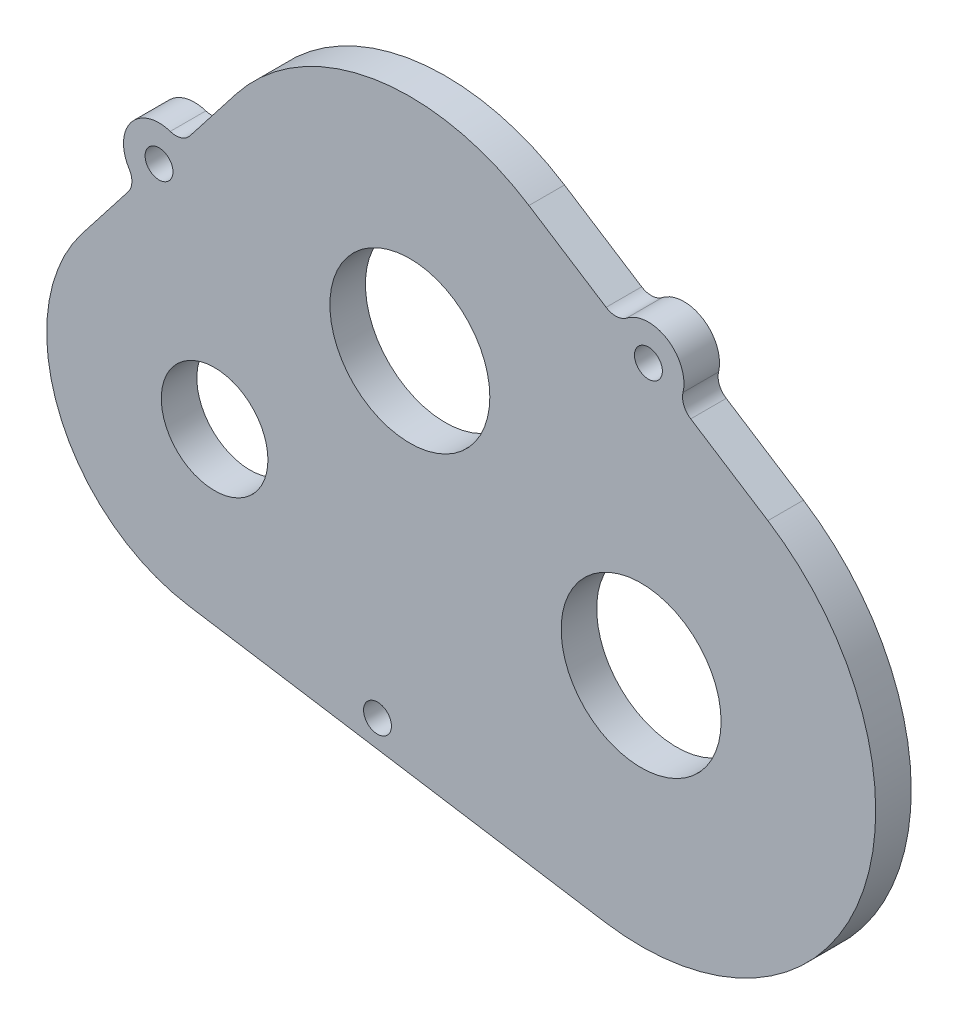
ISO-10303-21;
HEADER;
FILE_DESCRIPTION(('STEP AP214'),'2;1');
FILE_NAME('part.step','',(''),(''),'','','');
FILE_SCHEMA(('AUTOMOTIVE_DESIGN { 1 0 10303 214 1 1 1 1 }'));
ENDSEC;
DATA;
#1=APPLICATION_CONTEXT('core data for automotive mechanical design processes');
#2=APPLICATION_PROTOCOL_DEFINITION('international standard','automotive_design',2000,#1);
#3=PRODUCT_CONTEXT('',#1,'mechanical');
#4=PRODUCT('Part','Part','',(#3));
#5=PRODUCT_RELATED_PRODUCT_CATEGORY('part','',(#4));
#6=PRODUCT_DEFINITION_FORMATION('','',#4);
#7=PRODUCT_DEFINITION_CONTEXT('part definition',#1,'design');
#8=PRODUCT_DEFINITION('design','',#6,#7);
#9=PRODUCT_DEFINITION_SHAPE('','',#8);
#10=(LENGTH_UNIT() NAMED_UNIT(*) SI_UNIT(.MILLI.,.METRE.));
#11=(NAMED_UNIT(*) PLANE_ANGLE_UNIT() SI_UNIT($,.RADIAN.));
#12=(NAMED_UNIT(*) SI_UNIT($,.STERADIAN.) SOLID_ANGLE_UNIT());
#13=UNCERTAINTY_MEASURE_WITH_UNIT(LENGTH_MEASURE(1.E-05),#10,'distance_accuracy_value','');
#14=(GEOMETRIC_REPRESENTATION_CONTEXT(3) GLOBAL_UNCERTAINTY_ASSIGNED_CONTEXT((#13)) GLOBAL_UNIT_ASSIGNED_CONTEXT((#10,
#11,#12)) REPRESENTATION_CONTEXT('',''));
#15=CARTESIAN_POINT('',(0.,0.,0.));
#16=DIRECTION('',(0.,0.,1.));
#17=DIRECTION('',(1.,0.,0.));
#18=AXIS2_PLACEMENT_3D('',#15,#16,#17);
#19=CARTESIAN_POINT('',(-120.712153679958,100.012500000049,6.35));
#20=DIRECTION('',(0.,0.,1.));
#21=DIRECTION('',(1.,0.,0.));
#22=AXIS2_PLACEMENT_3D('',#19,#20,#21);
#23=PLANE('',#22);
#24=CARTESIAN_POINT('',(-43.2088176277902,148.984905649916,6.35));
#25=DIRECTION('',(0.,0.,1.));
#26=DIRECTION('',(1.,0.,0.));
#27=AXIS2_PLACEMENT_3D('',#24,#25,#26);
#28=CIRCLE('',#27,2.4892);
#29=CARTESIAN_POINT('',(-40.7196176277902,148.984905649916,6.35));
#30=VERTEX_POINT('',#29);
#31=EDGE_CURVE('E329',#30,#30,#28,.T.);
#32=ORIENTED_EDGE('',*,*,#31,.F.);
#33=EDGE_LOOP('',(#32));
#34=FACE_BOUND('',#33,.T.);
#35=CARTESIAN_POINT('',(-130.64022526333,136.096620740832,6.35));
#36=DIRECTION('',(0.,0.,1.));
#37=DIRECTION('',(1.,0.,0.));
#38=AXIS2_PLACEMENT_3D('',#35,#36,#37);
#39=CIRCLE('',#38,2.48920000000001);
#40=CARTESIAN_POINT('',(-128.15102526333,136.096620740832,6.35));
#41=VERTEX_POINT('',#40);
#42=EDGE_CURVE('E341',#41,#41,#39,.T.);
#43=ORIENTED_EDGE('',*,*,#42,.F.);
#44=EDGE_LOOP('',(#43));
#45=FACE_BOUND('',#44,.T.);
#46=CARTESIAN_POINT('',(-91.6087971250679,69.85553169687,6.35));
#47=DIRECTION('',(0.,0.,1.));
#48=DIRECTION('',(1.,0.,0.));
#49=AXIS2_PLACEMENT_3D('',#46,#47,#48);
#50=CIRCLE('',#49,2.4892);
#51=CARTESIAN_POINT('',(-89.1195971250679,69.85553169687,6.35));
#52=VERTEX_POINT('',#51);
#53=EDGE_CURVE('E174',#52,#52,#50,.T.);
#54=ORIENTED_EDGE('',*,*,#53,.F.);
#55=EDGE_LOOP('',(#54));
#56=FACE_BOUND('',#55,.T.);
#57=CARTESIAN_POINT('',(-120.712153679958,100.012500000049,6.35));
#58=DIRECTION('',(0.,0.,1.));
#59=DIRECTION('',(1.,0.,0.));
#60=AXIS2_PLACEMENT_3D('',#57,#58,#59);
#61=CIRCLE('',#60,30.);
#62=CARTESIAN_POINT('',(-144.384696493888,118.441029966453,6.35));
#63=VERTEX_POINT('',#62);
#64=CARTESIAN_POINT('',(-125.401130057911,70.3812074105077,6.35));
#65=VERTEX_POINT('',#64);
#66=EDGE_CURVE('E197',#63,#65,#61,.T.);
#67=ORIENTED_EDGE('',*,*,#66,.T.);
#68=DIRECTION('',(0.987709752984708,-0.156299212598425,0.));
#69=VECTOR('',#68,1.);
#70=CARTESIAN_POINT('',(-125.401130057911,70.3812074105077,6.35));
#71=LINE('',#70,#69);
#72=CARTESIAN_POINT('',(-51.0626536799579,58.6175842524599,6.35));
#73=VERTEX_POINT('',#72);
#74=EDGE_CURVE('E115',#65,#73,#71,.T.);
#75=ORIENTED_EDGE('',*,*,#74,.T.);
#76=CARTESIAN_POINT('',(-44.5121536799579,100.012500000049,6.35));
#77=DIRECTION('',(0.,0.,1.));
#78=DIRECTION('',(1.,0.,0.));
#79=AXIS2_PLACEMENT_3D('',#76,#77,#78);
#80=CIRCLE('',#79,41.91);
#81=CARTESIAN_POINT('',(-21.8638383761599,135.275822502328,6.35));
#82=VERTEX_POINT('',#81);
#83=EDGE_CURVE('E230',#73,#82,#80,.T.);
#84=ORIENTED_EDGE('',*,*,#83,.T.);
#85=DIRECTION('',(-0.841405929426847,0.540403610207541,0.));
#86=VECTOR('',#85,1.);
#87=CARTESIAN_POINT('',(-35.6527768797509,144.131942821502,6.35));
#88=LINE('',#87,#86);
#89=CARTESIAN_POINT('',(-35.6527768797509,144.131942821502,6.35));
#90=VERTEX_POINT('',#89);
#91=EDGE_CURVE('E249',#82,#90,#88,.T.);
#92=ORIENTED_EDGE('',*,*,#91,.T.);
#93=CARTESIAN_POINT('',(-33.9369954173419,146.803406647432,6.35));
#94=DIRECTION('',(0.,0.,-1.));
#95=DIRECTION('',(1.,0.,0.));
#96=AXIS2_PLACEMENT_3D('',#93,#94,#95);
#97=CIRCLE('',#96,3.17500000000001);
#98=CARTESIAN_POINT('',(-37.0276028208247,147.530572981593,6.35));
#99=VERTEX_POINT('',#98);
#100=EDGE_CURVE('E246',#90,#99,#97,.T.);
#101=ORIENTED_EDGE('',*,*,#100,.T.);
#102=CARTESIAN_POINT('',(-43.2088176277902,148.984905649916,6.35));
#103=DIRECTION('',(0.,0.,1.));
#104=DIRECTION('',(1.,0.,0.));
#105=AXIS2_PLACEMENT_3D('',#102,#103,#104);
#106=CIRCLE('',#105,6.34999999999999);
#107=CARTESIAN_POINT('',(-47.1023238182105,154.001190086145,6.35));
#108=VERTEX_POINT('',#107);
#109=EDGE_CURVE('E248',#99,#108,#106,.T.);
#110=ORIENTED_EDGE('',*,*,#109,.T.);
#111=CARTESIAN_POINT('',(-49.0490769134206,156.50933230426,6.35));
#112=DIRECTION('',(0.,0.,-1.));
#113=DIRECTION('',(1.,0.,0.));
#114=AXIS2_PLACEMENT_3D('',#111,#112,#113);
#115=CIRCLE('',#114,3.17499999999998);
#116=CARTESIAN_POINT('',(-50.7648583758295,153.83786847833,6.35));
#117=VERTEX_POINT('',#116);
#118=EDGE_CURVE('E251',#108,#117,#115,.T.);
#119=ORIENTED_EDGE('',*,*,#118,.T.);
#120=DIRECTION('',(-0.84140592942685,0.540403610207537,0.));
#121=VECTOR('',#120,1.);
#122=CARTESIAN_POINT('',(-64.5537968794204,162.693988797504,6.35));
#123=LINE('',#122,#121);
#124=CARTESIAN_POINT('',(-64.5537968794204,162.693988797504,6.35));
#125=VERTEX_POINT('',#124);
#126=EDGE_CURVE('E257',#117,#125,#123,.T.);
#127=ORIENTED_EDGE('',*,*,#126,.T.);
#128=CARTESIAN_POINT('',(-85.8294870132912,129.567837355969,6.35));
#129=DIRECTION('',(0.,0.,1.));
#130=DIRECTION('',(1.,0.,0.));
#131=AXIS2_PLACEMENT_3D('',#128,#129,#130);
#132=CIRCLE('',#131,39.37);
#133=CARTESIAN_POINT('',(-116.895754032773,153.752211515212,6.35));
#134=VERTEX_POINT('',#133);
#135=EDGE_CURVE('E259',#125,#134,#132,.T.);
#136=ORIENTED_EDGE('',*,*,#135,.T.);
#137=DIRECTION('',(-0.61428433221345,-0.789084760464347,0.));
#138=VECTOR('',#137,1.);
#139=CARTESIAN_POINT('',(-116.895754032773,153.752211515212,6.35));
#140=LINE('',#139,#138);
#141=CARTESIAN_POINT('',(-125.123794628894,143.182803991035,6.35));
#142=VERTEX_POINT('',#141);
#143=EDGE_CURVE('E261',#134,#142,#140,.T.);
#144=ORIENTED_EDGE('',*,*,#143,.T.);
#145=CARTESIAN_POINT('',(-127.629138743368,145.133156745812,6.35));
#146=DIRECTION('',(0.,0.,-1.));
#147=DIRECTION('',(1.,0.,0.));
#148=AXIS2_PLACEMENT_3D('',#145,#146,#147);
#149=CIRCLE('',#148,3.17499999999998);
#150=CARTESIAN_POINT('',(-128.632834250022,142.120978077486,6.35));
#151=VERTEX_POINT('',#150);
#152=EDGE_CURVE('E152',#142,#151,#149,.T.);
#153=ORIENTED_EDGE('',*,*,#152,.T.);
#154=CARTESIAN_POINT('',(-130.64022526333,136.096620740832,6.35));
#155=DIRECTION('',(0.,0.,1.));
#156=DIRECTION('',(1.,0.,0.));
#157=AXIS2_PLACEMENT_3D('',#154,#155,#156);
#158=CIRCLE('',#157,6.35);
#159=CARTESIAN_POINT('',(-135.988075095938,132.672733743883,6.35));
#160=VERTEX_POINT('',#159);
#161=EDGE_CURVE('E146',#151,#160,#158,.T.);
#162=ORIENTED_EDGE('',*,*,#161,.T.);
#163=CARTESIAN_POINT('',(-138.662000012241,130.960790245408,6.35));
#164=DIRECTION('',(0.,0.,-1.));
#165=DIRECTION('',(1.,0.,0.));
#166=AXIS2_PLACEMENT_3D('',#163,#164,#165);
#167=CIRCLE('',#166,3.17499999999999);
#168=CARTESIAN_POINT('',(-136.156655897767,129.01043749063,6.35));
#169=VERTEX_POINT('',#168);
#170=EDGE_CURVE('E150',#160,#169,#167,.T.);
#171=ORIENTED_EDGE('',*,*,#170,.T.);
#172=DIRECTION('',(-0.61428433221345,-0.789084760464347,0.));
#173=VECTOR('',#172,1.);
#174=CARTESIAN_POINT('',(-136.156655897767,129.01043749063,6.35));
#175=LINE('',#174,#173);
#176=EDGE_CURVE('E54',#169,#63,#175,.T.);
#177=ORIENTED_EDGE('',*,*,#176,.T.);
#178=EDGE_LOOP('',(#67,#75,#84,#92,#101,#110,#119,#127,#136,#144,#153,#162,#171,#177));
#179=FACE_BOUND('',#178,.T.);
#180=CARTESIAN_POINT('',(-44.5121536799579,100.012500000049,6.35));
#181=DIRECTION('',(0.,0.,1.));
#182=DIRECTION('',(1.,0.,0.));
#183=AXIS2_PLACEMENT_3D('',#180,#181,#182);
#184=CIRCLE('',#183,14.2875);
#185=CARTESIAN_POINT('',(-30.2246536799579,100.012500000049,6.35));
#186=VERTEX_POINT('',#185);
#187=EDGE_CURVE('E347',#186,#186,#184,.T.);
#188=ORIENTED_EDGE('',*,*,#187,.F.);
#189=EDGE_LOOP('',(#188));
#190=FACE_BOUND('',#189,.T.);
#191=CARTESIAN_POINT('',(-85.8294870132912,129.567837355969,6.35));
#192=DIRECTION('',(0.,0.,1.));
#193=DIRECTION('',(1.,0.,0.));
#194=AXIS2_PLACEMENT_3D('',#191,#192,#193);
#195=CIRCLE('',#194,14.2875);
#196=CARTESIAN_POINT('',(-71.5419870132912,129.567837355969,6.35));
#197=VERTEX_POINT('',#196);
#198=EDGE_CURVE('E335',#197,#197,#195,.T.);
#199=ORIENTED_EDGE('',*,*,#198,.F.);
#200=EDGE_LOOP('',(#199));
#201=FACE_BOUND('',#200,.T.);
#202=CARTESIAN_POINT('',(-120.712153679958,100.012500000049,6.35));
#203=DIRECTION('',(0.,0.,1.));
#204=DIRECTION('',(1.,0.,0.));
#205=AXIS2_PLACEMENT_3D('',#202,#203,#204);
#206=CIRCLE('',#205,9.52500000000001);
#207=CARTESIAN_POINT('',(-111.187153679958,100.012500000049,6.35));
#208=VERTEX_POINT('',#207);
#209=EDGE_CURVE('E320',#208,#208,#206,.T.);
#210=ORIENTED_EDGE('',*,*,#209,.F.);
#211=EDGE_LOOP('',(#210));
#212=FACE_BOUND('',#211,.T.);
#213=ADVANCED_FACE('F37',(#34,#45,#56,#179,#190,#201,#212),#23,.T.);
#214=CARTESIAN_POINT('',(-120.712153679958,100.012500000049,0.));
#215=DIRECTION('',(0.,0.,1.));
#216=DIRECTION('',(1.,0.,0.));
#217=AXIS2_PLACEMENT_3D('',#214,#215,#216);
#218=PLANE('',#217);
#219=CARTESIAN_POINT('',(-120.712153679958,100.012500000049,0.));
#220=DIRECTION('',(0.,0.,1.));
#221=DIRECTION('',(1.,0.,0.));
#222=AXIS2_PLACEMENT_3D('',#219,#220,#221);
#223=CIRCLE('',#222,30.);
#224=CARTESIAN_POINT('',(-144.384696493888,118.441029966453,0.));
#225=VERTEX_POINT('',#224);
#226=CARTESIAN_POINT('',(-125.401130057911,70.3812074105077,0.));
#227=VERTEX_POINT('',#226);
#228=EDGE_CURVE('E170',#225,#227,#223,.T.);
#229=ORIENTED_EDGE('',*,*,#228,.F.);
#230=DIRECTION('',(-0.61428433221345,-0.789084760464347,0.));
#231=VECTOR('',#230,1.);
#232=CARTESIAN_POINT('',(-136.156655897767,129.01043749063,0.));
#233=LINE('',#232,#231);
#234=CARTESIAN_POINT('',(-136.156655897767,129.01043749063,0.));
#235=VERTEX_POINT('',#234);
#236=EDGE_CURVE('E107',#235,#225,#233,.T.);
#237=ORIENTED_EDGE('',*,*,#236,.F.);
#238=CARTESIAN_POINT('',(-138.662000012241,130.960790245408,0.));
#239=DIRECTION('',(0.,0.,-1.));
#240=DIRECTION('',(1.,0.,0.));
#241=AXIS2_PLACEMENT_3D('',#238,#239,#240);
#242=CIRCLE('',#241,3.17499999999999);
#243=CARTESIAN_POINT('',(-135.988075095938,132.672733743883,0.));
#244=VERTEX_POINT('',#243);
#245=EDGE_CURVE('E101',#244,#235,#242,.T.);
#246=ORIENTED_EDGE('',*,*,#245,.F.);
#247=CARTESIAN_POINT('',(-130.64022526333,136.096620740832,0.));
#248=DIRECTION('',(0.,0.,1.));
#249=DIRECTION('',(1.,0.,0.));
#250=AXIS2_PLACEMENT_3D('',#247,#248,#249);
#251=CIRCLE('',#250,6.35);
#252=CARTESIAN_POINT('',(-128.632834250022,142.120978077486,0.));
#253=VERTEX_POINT('',#252);
#254=EDGE_CURVE('E160',#253,#244,#251,.T.);
#255=ORIENTED_EDGE('',*,*,#254,.F.);
#256=CARTESIAN_POINT('',(-127.629138743368,145.133156745812,0.));
#257=DIRECTION('',(0.,0.,-1.));
#258=DIRECTION('',(1.,0.,0.));
#259=AXIS2_PLACEMENT_3D('',#256,#257,#258);
#260=CIRCLE('',#259,3.17499999999998);
#261=CARTESIAN_POINT('',(-125.123794628894,143.182803991035,0.));
#262=VERTEX_POINT('',#261);
#263=EDGE_CURVE('E192',#262,#253,#260,.T.);
#264=ORIENTED_EDGE('',*,*,#263,.F.);
#265=DIRECTION('',(-0.61428433221345,-0.789084760464347,0.));
#266=VECTOR('',#265,1.);
#267=CARTESIAN_POINT('',(-116.895754032773,153.752211515212,0.));
#268=LINE('',#267,#266);
#269=CARTESIAN_POINT('',(-116.895754032773,153.752211515212,0.));
#270=VERTEX_POINT('',#269);
#271=EDGE_CURVE('E190',#270,#262,#268,.T.);
#272=ORIENTED_EDGE('',*,*,#271,.F.);
#273=CARTESIAN_POINT('',(-85.8294870132912,129.567837355969,0.));
#274=DIRECTION('',(0.,0.,1.));
#275=DIRECTION('',(1.,0.,0.));
#276=AXIS2_PLACEMENT_3D('',#273,#274,#275);
#277=CIRCLE('',#276,39.37);
#278=CARTESIAN_POINT('',(-64.5537968794204,162.693988797504,0.));
#279=VERTEX_POINT('',#278);
#280=EDGE_CURVE('E188',#279,#270,#277,.T.);
#281=ORIENTED_EDGE('',*,*,#280,.F.);
#282=DIRECTION('',(-0.84140592942685,0.540403610207537,0.));
#283=VECTOR('',#282,1.);
#284=CARTESIAN_POINT('',(-64.5537968794204,162.693988797504,0.));
#285=LINE('',#284,#283);
#286=CARTESIAN_POINT('',(-50.7648583758295,153.83786847833,0.));
#287=VERTEX_POINT('',#286);
#288=EDGE_CURVE('E186',#287,#279,#285,.T.);
#289=ORIENTED_EDGE('',*,*,#288,.F.);
#290=CARTESIAN_POINT('',(-49.0490769134206,156.50933230426,0.));
#291=DIRECTION('',(0.,0.,-1.));
#292=DIRECTION('',(1.,0.,0.));
#293=AXIS2_PLACEMENT_3D('',#290,#291,#292);
#294=CIRCLE('',#293,3.17499999999998);
#295=CARTESIAN_POINT('',(-47.1023238182105,154.001190086145,0.));
#296=VERTEX_POINT('',#295);
#297=EDGE_CURVE('E184',#296,#287,#294,.T.);
#298=ORIENTED_EDGE('',*,*,#297,.F.);
#299=CARTESIAN_POINT('',(-43.2088176277902,148.984905649916,0.));
#300=DIRECTION('',(0.,0.,1.));
#301=DIRECTION('',(1.,0.,0.));
#302=AXIS2_PLACEMENT_3D('',#299,#300,#301);
#303=CIRCLE('',#302,6.34999999999999);
#304=CARTESIAN_POINT('',(-37.0276028208247,147.530572981593,0.));
#305=VERTEX_POINT('',#304);
#306=EDGE_CURVE('E182',#305,#296,#303,.T.);
#307=ORIENTED_EDGE('',*,*,#306,.F.);
#308=CARTESIAN_POINT('',(-33.9369954173419,146.803406647432,0.));
#309=DIRECTION('',(0.,0.,-1.));
#310=DIRECTION('',(1.,0.,0.));
#311=AXIS2_PLACEMENT_3D('',#308,#309,#310);
#312=CIRCLE('',#311,3.17500000000001);
#313=CARTESIAN_POINT('',(-35.6527768797509,144.131942821502,0.));
#314=VERTEX_POINT('',#313);
#315=EDGE_CURVE('E180',#314,#305,#312,.T.);
#316=ORIENTED_EDGE('',*,*,#315,.F.);
#317=DIRECTION('',(-0.841405929426847,0.540403610207541,0.));
#318=VECTOR('',#317,1.);
#319=CARTESIAN_POINT('',(-35.6527768797509,144.131942821502,0.));
#320=LINE('',#319,#318);
#321=CARTESIAN_POINT('',(-21.8638383761599,135.275822502328,0.));
#322=VERTEX_POINT('',#321);
#323=EDGE_CURVE('E178',#322,#314,#320,.T.);
#324=ORIENTED_EDGE('',*,*,#323,.F.);
#325=CARTESIAN_POINT('',(-44.5121536799579,100.012500000049,0.));
#326=DIRECTION('',(0.,0.,1.));
#327=DIRECTION('',(1.,0.,0.));
#328=AXIS2_PLACEMENT_3D('',#325,#326,#327);
#329=CIRCLE('',#328,41.91);
#330=CARTESIAN_POINT('',(-51.0626536799579,58.6175842524599,0.));
#331=VERTEX_POINT('',#330);
#332=EDGE_CURVE('E176',#331,#322,#329,.T.);
#333=ORIENTED_EDGE('',*,*,#332,.F.);
#334=DIRECTION('',(0.987709752984708,-0.156299212598425,0.));
#335=VECTOR('',#334,1.);
#336=CARTESIAN_POINT('',(-125.401130057911,70.3812074105077,0.));
#337=LINE('',#336,#335);
#338=EDGE_CURVE('E173',#227,#331,#337,.T.);
#339=ORIENTED_EDGE('',*,*,#338,.F.);
#340=EDGE_LOOP('',(#229,#237,#246,#255,#264,#272,#281,#289,#298,#307,#316,#324,#333,#339));
#341=FACE_BOUND('',#340,.T.);
#342=CARTESIAN_POINT('',(-91.6087971250679,69.85553169687,0.));
#343=DIRECTION('',(0.,0.,1.));
#344=DIRECTION('',(1.,0.,0.));
#345=AXIS2_PLACEMENT_3D('',#342,#343,#344);
#346=CIRCLE('',#345,2.4892);
#347=CARTESIAN_POINT('',(-89.1195971250679,69.85553169687,0.));
#348=VERTEX_POINT('',#347);
#349=EDGE_CURVE('E350',#348,#348,#346,.T.);
#350=ORIENTED_EDGE('',*,*,#349,.T.);
#351=EDGE_LOOP('',(#350));
#352=FACE_BOUND('',#351,.T.);
#353=CARTESIAN_POINT('',(-44.5121536799579,100.012500000049,0.));
#354=DIRECTION('',(0.,0.,1.));
#355=DIRECTION('',(1.,0.,0.));
#356=AXIS2_PLACEMENT_3D('',#353,#354,#355);
#357=CIRCLE('',#356,14.2875);
#358=CARTESIAN_POINT('',(-30.2246536799579,100.012500000049,0.));
#359=VERTEX_POINT('',#358);
#360=EDGE_CURVE('E344',#359,#359,#357,.T.);
#361=ORIENTED_EDGE('',*,*,#360,.T.);
#362=EDGE_LOOP('',(#361));
#363=FACE_BOUND('',#362,.T.);
#364=CARTESIAN_POINT('',(-130.64022526333,136.096620740832,0.));
#365=DIRECTION('',(0.,0.,1.));
#366=DIRECTION('',(1.,0.,0.));
#367=AXIS2_PLACEMENT_3D('',#364,#365,#366);
#368=CIRCLE('',#367,2.48920000000001);
#369=CARTESIAN_POINT('',(-128.15102526333,136.096620740832,0.));
#370=VERTEX_POINT('',#369);
#371=EDGE_CURVE('E338',#370,#370,#368,.T.);
#372=ORIENTED_EDGE('',*,*,#371,.T.);
#373=EDGE_LOOP('',(#372));
#374=FACE_BOUND('',#373,.T.);
#375=CARTESIAN_POINT('',(-85.8294870132912,129.567837355969,0.));
#376=DIRECTION('',(0.,0.,1.));
#377=DIRECTION('',(1.,0.,0.));
#378=AXIS2_PLACEMENT_3D('',#375,#376,#377);
#379=CIRCLE('',#378,14.2875);
#380=CARTESIAN_POINT('',(-71.5419870132912,129.567837355969,0.));
#381=VERTEX_POINT('',#380);
#382=EDGE_CURVE('E332',#381,#381,#379,.T.);
#383=ORIENTED_EDGE('',*,*,#382,.T.);
#384=EDGE_LOOP('',(#383));
#385=FACE_BOUND('',#384,.T.);
#386=CARTESIAN_POINT('',(-43.2088176277902,148.984905649916,0.));
#387=DIRECTION('',(0.,0.,1.));
#388=DIRECTION('',(1.,0.,0.));
#389=AXIS2_PLACEMENT_3D('',#386,#387,#388);
#390=CIRCLE('',#389,2.4892);
#391=CARTESIAN_POINT('',(-40.7196176277902,148.984905649916,0.));
#392=VERTEX_POINT('',#391);
#393=EDGE_CURVE('E326',#392,#392,#390,.T.);
#394=ORIENTED_EDGE('',*,*,#393,.T.);
#395=EDGE_LOOP('',(#394));
#396=FACE_BOUND('',#395,.T.);
#397=CARTESIAN_POINT('',(-120.712153679958,100.012500000049,0.));
#398=DIRECTION('',(0.,0.,1.));
#399=DIRECTION('',(1.,0.,0.));
#400=AXIS2_PLACEMENT_3D('',#397,#398,#399);
#401=CIRCLE('',#400,9.52500000000001);
#402=CARTESIAN_POINT('',(-111.187153679958,100.012500000049,0.));
#403=VERTEX_POINT('',#402);
#404=EDGE_CURVE('E323',#403,#403,#401,.T.);
#405=ORIENTED_EDGE('',*,*,#404,.T.);
#406=EDGE_LOOP('',(#405));
#407=FACE_BOUND('',#406,.T.);
#408=ADVANCED_FACE('F234',(#341,#352,#363,#374,#385,#396,#407),#218,.F.);
#409=CARTESIAN_POINT('',(-120.712153679958,100.012500000049,6.35));
#410=DIRECTION('',(0.,0.,-1.));
#411=DIRECTION('',(-1.,0.,0.));
#412=AXIS2_PLACEMENT_3D('',#409,#410,#411);
#413=CYLINDRICAL_SURFACE('',#412,30.);
#414=ORIENTED_EDGE('',*,*,#228,.T.);
#415=DIRECTION('',(0.,0.,-1.));
#416=VECTOR('',#415,1.);
#417=CARTESIAN_POINT('',(-125.401130057911,70.3812074105077,6.35));
#418=LINE('',#417,#416);
#419=EDGE_CURVE('E11',#65,#227,#418,.T.);
#420=ORIENTED_EDGE('',*,*,#419,.F.);
#421=ORIENTED_EDGE('',*,*,#66,.F.);
#422=DIRECTION('',(0.,0.,-1.));
#423=VECTOR('',#422,1.);
#424=CARTESIAN_POINT('',(-144.384696493888,118.441029966453,6.35));
#425=LINE('',#424,#423);
#426=EDGE_CURVE('E166',#63,#225,#425,.T.);
#427=ORIENTED_EDGE('',*,*,#426,.T.);
#428=EDGE_LOOP('',(#414,#420,#421,#427));
#429=FACE_BOUND('',#428,.T.);
#430=ADVANCED_FACE('F39',(#429),#413,.T.);
#431=CARTESIAN_POINT('',(-125.401130057911,70.3812074105077,6.35));
#432=DIRECTION('',(0.156299212598425,0.987709752984708,0.));
#433=DIRECTION('',(-0.987709752984708,0.156299212598425,0.));
#434=AXIS2_PLACEMENT_3D('',#431,#432,#433);
#435=PLANE('',#434);
#436=ORIENTED_EDGE('',*,*,#338,.T.);
#437=DIRECTION('',(0.,0.,-1.));
#438=VECTOR('',#437,1.);
#439=CARTESIAN_POINT('',(-51.0626536799579,58.6175842524599,6.35));
#440=LINE('',#439,#438);
#441=EDGE_CURVE('E46',#73,#331,#440,.T.);
#442=ORIENTED_EDGE('',*,*,#441,.F.);
#443=ORIENTED_EDGE('',*,*,#74,.F.);
#444=ORIENTED_EDGE('',*,*,#419,.T.);
#445=EDGE_LOOP('',(#436,#442,#443,#444));
#446=FACE_BOUND('',#445,.T.);
#447=ADVANCED_FACE('F510',(#446),#435,.F.);
#448=CARTESIAN_POINT('',(-44.5121536799579,100.012500000049,6.35));
#449=DIRECTION('',(0.,0.,-1.));
#450=DIRECTION('',(-1.,0.,0.));
#451=AXIS2_PLACEMENT_3D('',#448,#449,#450);
#452=CYLINDRICAL_SURFACE('',#451,41.91);
#453=ORIENTED_EDGE('',*,*,#332,.T.);
#454=DIRECTION('',(0.,0.,-1.));
#455=VECTOR('',#454,1.);
#456=CARTESIAN_POINT('',(-21.8638383761599,135.275822502328,6.35));
#457=LINE('',#456,#455);
#458=EDGE_CURVE('E222',#82,#322,#457,.T.);
#459=ORIENTED_EDGE('',*,*,#458,.F.);
#460=ORIENTED_EDGE('',*,*,#83,.F.);
#461=ORIENTED_EDGE('',*,*,#441,.T.);
#462=EDGE_LOOP('',(#453,#459,#460,#461));
#463=FACE_BOUND('',#462,.T.);
#464=ADVANCED_FACE('F228',(#463),#452,.T.);
#465=CARTESIAN_POINT('',(-35.6527768797509,144.131942821502,6.35));
#466=DIRECTION('',(-0.540403610207541,-0.841405929426847,0.));
#467=DIRECTION('',(0.841405929426847,-0.540403610207541,0.));
#468=AXIS2_PLACEMENT_3D('',#465,#466,#467);
#469=PLANE('',#468);
#470=ORIENTED_EDGE('',*,*,#323,.T.);
#471=DIRECTION('',(0.,0.,-1.));
#472=VECTOR('',#471,1.);
#473=CARTESIAN_POINT('',(-35.6527768797509,144.131942821502,6.35));
#474=LINE('',#473,#472);
#475=EDGE_CURVE('E219',#90,#314,#474,.T.);
#476=ORIENTED_EDGE('',*,*,#475,.F.);
#477=ORIENTED_EDGE('',*,*,#91,.F.);
#478=ORIENTED_EDGE('',*,*,#458,.T.);
#479=EDGE_LOOP('',(#470,#476,#477,#478));
#480=FACE_BOUND('',#479,.T.);
#481=ADVANCED_FACE('F240',(#480),#469,.F.);
#482=CARTESIAN_POINT('',(-33.9369954173419,146.803406647432,6.35));
#483=DIRECTION('',(0.,0.,-1.));
#484=DIRECTION('',(-1.,0.,0.));
#485=AXIS2_PLACEMENT_3D('',#482,#483,#484);
#486=CYLINDRICAL_SURFACE('',#485,3.17500000000001);
#487=ORIENTED_EDGE('',*,*,#315,.T.);
#488=DIRECTION('',(0.,0.,-1.));
#489=VECTOR('',#488,1.);
#490=CARTESIAN_POINT('',(-37.0276028208247,147.530572981593,6.35));
#491=LINE('',#490,#489);
#492=EDGE_CURVE('E216',#99,#305,#491,.T.);
#493=ORIENTED_EDGE('',*,*,#492,.F.);
#494=ORIENTED_EDGE('',*,*,#100,.F.);
#495=ORIENTED_EDGE('',*,*,#475,.T.);
#496=EDGE_LOOP('',(#487,#493,#494,#495));
#497=FACE_BOUND('',#496,.T.);
#498=ADVANCED_FACE('F244',(#497),#486,.F.);
#499=CARTESIAN_POINT('',(-43.2088176277902,148.984905649916,6.35));
#500=DIRECTION('',(0.,0.,-1.));
#501=DIRECTION('',(-1.,0.,0.));
#502=AXIS2_PLACEMENT_3D('',#499,#500,#501);
#503=CYLINDRICAL_SURFACE('',#502,6.34999999999999);
#504=ORIENTED_EDGE('',*,*,#306,.T.);
#505=DIRECTION('',(0.,0.,-1.));
#506=VECTOR('',#505,1.);
#507=CARTESIAN_POINT('',(-47.1023238182105,154.001190086145,6.35));
#508=LINE('',#507,#506);
#509=EDGE_CURVE('E213',#108,#296,#508,.T.);
#510=ORIENTED_EDGE('',*,*,#509,.F.);
#511=ORIENTED_EDGE('',*,*,#109,.F.);
#512=ORIENTED_EDGE('',*,*,#492,.T.);
#513=EDGE_LOOP('',(#504,#510,#511,#512));
#514=FACE_BOUND('',#513,.T.);
#515=ADVANCED_FACE('F471',(#514),#503,.T.);
#516=CARTESIAN_POINT('',(-49.0490769134206,156.50933230426,6.35));
#517=DIRECTION('',(0.,0.,-1.));
#518=DIRECTION('',(-1.,0.,0.));
#519=AXIS2_PLACEMENT_3D('',#516,#517,#518);
#520=CYLINDRICAL_SURFACE('',#519,3.17499999999998);
#521=ORIENTED_EDGE('',*,*,#297,.T.);
#522=DIRECTION('',(0.,0.,-1.));
#523=VECTOR('',#522,1.);
#524=CARTESIAN_POINT('',(-50.7648583758295,153.83786847833,6.35));
#525=LINE('',#524,#523);
#526=EDGE_CURVE('E210',#117,#287,#525,.T.);
#527=ORIENTED_EDGE('',*,*,#526,.F.);
#528=ORIENTED_EDGE('',*,*,#118,.F.);
#529=ORIENTED_EDGE('',*,*,#509,.T.);
#530=EDGE_LOOP('',(#521,#527,#528,#529));
#531=FACE_BOUND('',#530,.T.);
#532=ADVANCED_FACE('F460',(#531),#520,.F.);
#533=CARTESIAN_POINT('',(-64.5537968794204,162.693988797504,6.35));
#534=DIRECTION('',(-0.540403610207537,-0.841405929426849,0.));
#535=DIRECTION('',(0.84140592942685,-0.540403610207537,0.));
#536=AXIS2_PLACEMENT_3D('',#533,#534,#535);
#537=PLANE('',#536);
#538=ORIENTED_EDGE('',*,*,#288,.T.);
#539=DIRECTION('',(0.,0.,-1.));
#540=VECTOR('',#539,1.);
#541=CARTESIAN_POINT('',(-64.5537968794204,162.693988797504,6.35));
#542=LINE('',#541,#540);
#543=EDGE_CURVE('E207',#125,#279,#542,.T.);
#544=ORIENTED_EDGE('',*,*,#543,.F.);
#545=ORIENTED_EDGE('',*,*,#126,.F.);
#546=ORIENTED_EDGE('',*,*,#526,.T.);
#547=EDGE_LOOP('',(#538,#544,#545,#546));
#548=FACE_BOUND('',#547,.T.);
#549=ADVANCED_FACE('F449',(#548),#537,.F.);
#550=CARTESIAN_POINT('',(-85.8294870132912,129.567837355969,6.35));
#551=DIRECTION('',(0.,0.,-1.));
#552=DIRECTION('',(-1.,0.,0.));
#553=AXIS2_PLACEMENT_3D('',#550,#551,#552);
#554=CYLINDRICAL_SURFACE('',#553,39.37);
#555=ORIENTED_EDGE('',*,*,#280,.T.);
#556=DIRECTION('',(0.,0.,-1.));
#557=VECTOR('',#556,1.);
#558=CARTESIAN_POINT('',(-116.895754032773,153.752211515212,6.35));
#559=LINE('',#558,#557);
#560=EDGE_CURVE('E204',#134,#270,#559,.T.);
#561=ORIENTED_EDGE('',*,*,#560,.F.);
#562=ORIENTED_EDGE('',*,*,#135,.F.);
#563=ORIENTED_EDGE('',*,*,#543,.T.);
#564=EDGE_LOOP('',(#555,#561,#562,#563));
#565=FACE_BOUND('',#564,.T.);
#566=ADVANCED_FACE('F439',(#565),#554,.T.);
#567=CARTESIAN_POINT('',(-116.895754032773,153.752211515212,6.35));
#568=DIRECTION('',(0.789084760464347,-0.614284332213451,0.));
#569=DIRECTION('',(0.61428433221345,0.789084760464347,0.));
#570=AXIS2_PLACEMENT_3D('',#567,#568,#569);
#571=PLANE('',#570);
#572=ORIENTED_EDGE('',*,*,#271,.T.);
#573=DIRECTION('',(0.,0.,-1.));
#574=VECTOR('',#573,1.);
#575=CARTESIAN_POINT('',(-125.123794628894,143.182803991035,6.35));
#576=LINE('',#575,#574);
#577=EDGE_CURVE('E201',#142,#262,#576,.T.);
#578=ORIENTED_EDGE('',*,*,#577,.F.);
#579=ORIENTED_EDGE('',*,*,#143,.F.);
#580=ORIENTED_EDGE('',*,*,#560,.T.);
#581=EDGE_LOOP('',(#572,#578,#579,#580));
#582=FACE_BOUND('',#581,.T.);
#583=ADVANCED_FACE('F267',(#582),#571,.F.);
#584=CARTESIAN_POINT('',(-127.629138743368,145.133156745812,6.35));
#585=DIRECTION('',(0.,0.,-1.));
#586=DIRECTION('',(-1.,0.,0.));
#587=AXIS2_PLACEMENT_3D('',#584,#585,#586);
#588=CYLINDRICAL_SURFACE('',#587,3.17499999999998);
#589=ORIENTED_EDGE('',*,*,#263,.T.);
#590=DIRECTION('',(0.,0.,-1.));
#591=VECTOR('',#590,1.);
#592=CARTESIAN_POINT('',(-128.632834250022,142.120978077486,6.35));
#593=LINE('',#592,#591);
#594=EDGE_CURVE('E161',#151,#253,#593,.T.);
#595=ORIENTED_EDGE('',*,*,#594,.F.);
#596=ORIENTED_EDGE('',*,*,#152,.F.);
#597=ORIENTED_EDGE('',*,*,#577,.T.);
#598=EDGE_LOOP('',(#589,#595,#596,#597));
#599=FACE_BOUND('',#598,.T.);
#600=ADVANCED_FACE('F271',(#599),#588,.F.);
#601=CARTESIAN_POINT('',(-130.64022526333,136.096620740832,6.35));
#602=DIRECTION('',(0.,0.,-1.));
#603=DIRECTION('',(-1.,0.,0.));
#604=AXIS2_PLACEMENT_3D('',#601,#602,#603);
#605=CYLINDRICAL_SURFACE('',#604,6.35);
#606=ORIENTED_EDGE('',*,*,#254,.T.);
#607=DIRECTION('',(0.,0.,-1.));
#608=VECTOR('',#607,1.);
#609=CARTESIAN_POINT('',(-135.988075095938,132.672733743883,6.35));
#610=LINE('',#609,#608);
#611=EDGE_CURVE('E157',#160,#244,#610,.T.);
#612=ORIENTED_EDGE('',*,*,#611,.F.);
#613=ORIENTED_EDGE('',*,*,#161,.F.);
#614=ORIENTED_EDGE('',*,*,#594,.T.);
#615=EDGE_LOOP('',(#606,#612,#613,#614));
#616=FACE_BOUND('',#615,.T.);
#617=ADVANCED_FACE('F158',(#616),#605,.T.);
#618=CARTESIAN_POINT('',(-138.662000012241,130.960790245408,6.35));
#619=DIRECTION('',(0.,0.,-1.));
#620=DIRECTION('',(-1.,0.,0.));
#621=AXIS2_PLACEMENT_3D('',#618,#619,#620);
#622=CYLINDRICAL_SURFACE('',#621,3.17499999999999);
#623=ORIENTED_EDGE('',*,*,#245,.T.);
#624=DIRECTION('',(0.,0.,-1.));
#625=VECTOR('',#624,1.);
#626=CARTESIAN_POINT('',(-136.156655897767,129.01043749063,6.35));
#627=LINE('',#626,#625);
#628=EDGE_CURVE('E162',#169,#235,#627,.T.);
#629=ORIENTED_EDGE('',*,*,#628,.F.);
#630=ORIENTED_EDGE('',*,*,#170,.F.);
#631=ORIENTED_EDGE('',*,*,#611,.T.);
#632=EDGE_LOOP('',(#623,#629,#630,#631));
#633=FACE_BOUND('',#632,.T.);
#634=ADVANCED_FACE('F164',(#633),#622,.F.);
#635=CARTESIAN_POINT('',(-136.156655897767,129.01043749063,6.35));
#636=DIRECTION('',(0.789084760464347,-0.61428433221345,0.));
#637=DIRECTION('',(0.61428433221345,0.789084760464347,0.));
#638=AXIS2_PLACEMENT_3D('',#635,#636,#637);
#639=PLANE('',#638);
#640=ORIENTED_EDGE('',*,*,#236,.T.);
#641=ORIENTED_EDGE('',*,*,#426,.F.);
#642=ORIENTED_EDGE('',*,*,#176,.F.);
#643=ORIENTED_EDGE('',*,*,#628,.T.);
#644=EDGE_LOOP('',(#640,#641,#642,#643));
#645=FACE_BOUND('',#644,.T.);
#646=ADVANCED_FACE('F275',(#645),#639,.F.);
#647=CARTESIAN_POINT('',(-91.6087971250679,69.85553169687,6.35));
#648=DIRECTION('',(0.,0.,-1.));
#649=DIRECTION('',(-1.,0.,0.));
#650=AXIS2_PLACEMENT_3D('',#647,#648,#649);
#651=CYLINDRICAL_SURFACE('',#650,2.4892);
#652=ORIENTED_EDGE('',*,*,#53,.T.);
#653=EDGE_LOOP('',(#652));
#654=FACE_BOUND('',#653,.T.);
#655=ORIENTED_EDGE('',*,*,#349,.F.);
#656=EDGE_LOOP('',(#655));
#657=FACE_BOUND('',#656,.T.);
#658=ADVANCED_FACE('F277',(#654,#657),#651,.F.);
#659=CARTESIAN_POINT('',(-44.5121536799579,100.012500000049,6.35));
#660=DIRECTION('',(0.,0.,-1.));
#661=DIRECTION('',(-1.,0.,0.));
#662=AXIS2_PLACEMENT_3D('',#659,#660,#661);
#663=CYLINDRICAL_SURFACE('',#662,14.2875);
#664=ORIENTED_EDGE('',*,*,#187,.T.);
#665=EDGE_LOOP('',(#664));
#666=FACE_BOUND('',#665,.T.);
#667=ORIENTED_EDGE('',*,*,#360,.F.);
#668=EDGE_LOOP('',(#667));
#669=FACE_BOUND('',#668,.T.);
#670=ADVANCED_FACE('F283',(#666,#669),#663,.F.);
#671=CARTESIAN_POINT('',(-130.64022526333,136.096620740832,6.35));
#672=DIRECTION('',(0.,0.,-1.));
#673=DIRECTION('',(-1.,0.,0.));
#674=AXIS2_PLACEMENT_3D('',#671,#672,#673);
#675=CYLINDRICAL_SURFACE('',#674,2.48920000000001);
#676=ORIENTED_EDGE('',*,*,#42,.T.);
#677=EDGE_LOOP('',(#676));
#678=FACE_BOUND('',#677,.T.);
#679=ORIENTED_EDGE('',*,*,#371,.F.);
#680=EDGE_LOOP('',(#679));
#681=FACE_BOUND('',#680,.T.);
#682=ADVANCED_FACE('F299',(#678,#681),#675,.F.);
#683=CARTESIAN_POINT('',(-85.8294870132912,129.567837355969,6.35));
#684=DIRECTION('',(0.,0.,-1.));
#685=DIRECTION('',(-1.,0.,0.));
#686=AXIS2_PLACEMENT_3D('',#683,#684,#685);
#687=CYLINDRICAL_SURFACE('',#686,14.2875);
#688=ORIENTED_EDGE('',*,*,#198,.T.);
#689=EDGE_LOOP('',(#688));
#690=FACE_BOUND('',#689,.T.);
#691=ORIENTED_EDGE('',*,*,#382,.F.);
#692=EDGE_LOOP('',(#691));
#693=FACE_BOUND('',#692,.T.);
#694=ADVANCED_FACE('F303',(#690,#693),#687,.F.);
#695=CARTESIAN_POINT('',(-43.2088176277902,148.984905649916,6.35));
#696=DIRECTION('',(0.,0.,-1.));
#697=DIRECTION('',(-1.,0.,0.));
#698=AXIS2_PLACEMENT_3D('',#695,#696,#697);
#699=CYLINDRICAL_SURFACE('',#698,2.4892);
#700=ORIENTED_EDGE('',*,*,#31,.T.);
#701=EDGE_LOOP('',(#700));
#702=FACE_BOUND('',#701,.T.);
#703=ORIENTED_EDGE('',*,*,#393,.F.);
#704=EDGE_LOOP('',(#703));
#705=FACE_BOUND('',#704,.T.);
#706=ADVANCED_FACE('F307',(#702,#705),#699,.F.);
#707=CARTESIAN_POINT('',(-120.712153679958,100.012500000049,6.35));
#708=DIRECTION('',(0.,0.,-1.));
#709=DIRECTION('',(-1.,0.,0.));
#710=AXIS2_PLACEMENT_3D('',#707,#708,#709);
#711=CYLINDRICAL_SURFACE('',#710,9.52500000000001);
#712=ORIENTED_EDGE('',*,*,#209,.T.);
#713=EDGE_LOOP('',(#712));
#714=FACE_BOUND('',#713,.T.);
#715=ORIENTED_EDGE('',*,*,#404,.F.);
#716=EDGE_LOOP('',(#715));
#717=FACE_BOUND('',#716,.T.);
#718=ADVANCED_FACE('F311',(#714,#717),#711,.F.);
#719=CLOSED_SHELL('',(#213,#408,#430,#447,#464,#481,#498,#515,#532,#549,#566,#583,#600,#617,
#634,#646,#658,#670,#682,#694,#706,#718));
#720=MANIFOLD_SOLID_BREP('B2',#719);
#721=ADVANCED_BREP_SHAPE_REPRESENTATION('',(#18,#720),#14);
#722=SHAPE_DEFINITION_REPRESENTATION(#9,#721);
ENDSEC;
END-ISO-10303-21;
